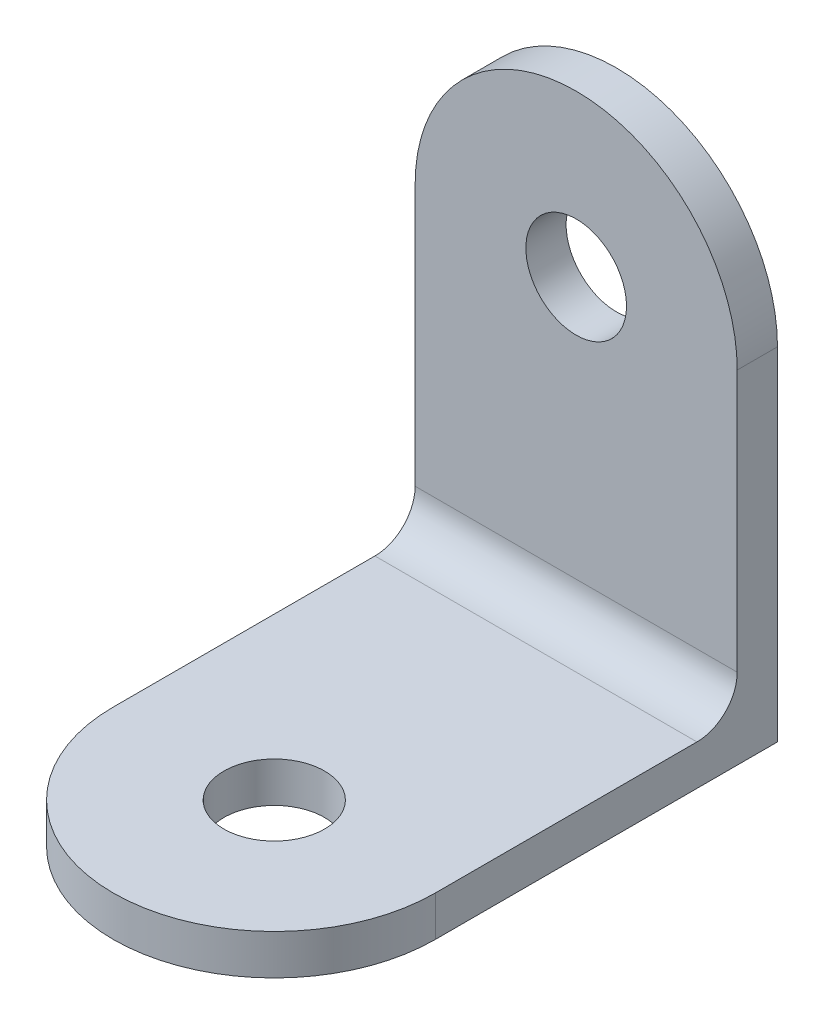
ISO-10303-21;
HEADER;
FILE_DESCRIPTION(('STEP AP214'),'2;1');
FILE_NAME('part.step','',(''),(''),'','','');
FILE_SCHEMA(('AUTOMOTIVE_DESIGN { 1 0 10303 214 1 1 1 1 }'));
ENDSEC;
DATA;
#1=APPLICATION_CONTEXT('core data for automotive mechanical design processes');
#2=APPLICATION_PROTOCOL_DEFINITION('international standard','automotive_design',2000,#1);
#3=PRODUCT_CONTEXT('',#1,'mechanical');
#4=PRODUCT('Part','Part','',(#3));
#5=PRODUCT_RELATED_PRODUCT_CATEGORY('part','',(#4));
#6=PRODUCT_DEFINITION_FORMATION('','',#4);
#7=PRODUCT_DEFINITION_CONTEXT('part definition',#1,'design');
#8=PRODUCT_DEFINITION('design','',#6,#7);
#9=PRODUCT_DEFINITION_SHAPE('','',#8);
#10=(LENGTH_UNIT() NAMED_UNIT(*) SI_UNIT(.MILLI.,.METRE.));
#11=(NAMED_UNIT(*) PLANE_ANGLE_UNIT() SI_UNIT($,.RADIAN.));
#12=(NAMED_UNIT(*) SI_UNIT($,.STERADIAN.) SOLID_ANGLE_UNIT());
#13=UNCERTAINTY_MEASURE_WITH_UNIT(LENGTH_MEASURE(1.E-05),#10,'distance_accuracy_value','');
#14=(GEOMETRIC_REPRESENTATION_CONTEXT(3) GLOBAL_UNCERTAINTY_ASSIGNED_CONTEXT((#13)) GLOBAL_UNIT_ASSIGNED_CONTEXT((#10,
#11,#12)) REPRESENTATION_CONTEXT('',''));
#15=CARTESIAN_POINT('',(0.,0.,0.));
#16=DIRECTION('',(0.,0.,1.));
#17=DIRECTION('',(1.,0.,0.));
#18=AXIS2_PLACEMENT_3D('',#15,#16,#17);
#19=CARTESIAN_POINT('',(16.,0.,0.));
#20=DIRECTION('',(0.,1.,0.));
#21=DIRECTION('',(0.,0.,1.));
#22=AXIS2_PLACEMENT_3D('',#19,#20,#21);
#23=PLANE('',#22);
#24=CARTESIAN_POINT('',(8.,0.,0.));
#25=DIRECTION('',(0.,1.,0.));
#26=DIRECTION('',(0.,0.,1.));
#27=AXIS2_PLACEMENT_3D('',#24,#25,#26);
#28=CIRCLE('',#27,2.5);
#29=CARTESIAN_POINT('',(8.,0.,2.5));
#30=VERTEX_POINT('',#29);
#31=EDGE_CURVE('E163',#30,#30,#28,.T.);
#32=ORIENTED_EDGE('',*,*,#31,.T.);
#33=EDGE_LOOP('',(#32));
#34=FACE_BOUND('',#33,.T.);
#35=DIRECTION('',(0.,0.,-1.));
#36=VECTOR('',#35,1.);
#37=CARTESIAN_POINT('',(0.,0.,0.));
#38=LINE('',#37,#36);
#39=CARTESIAN_POINT('',(0.,0.,0.));
#40=VERTEX_POINT('',#39);
#41=CARTESIAN_POINT('',(0.,0.,-17.));
#42=VERTEX_POINT('',#41);
#43=EDGE_CURVE('E91',#40,#42,#38,.T.);
#44=ORIENTED_EDGE('',*,*,#43,.T.);
#45=DIRECTION('',(-1.,0.,0.));
#46=VECTOR('',#45,1.);
#47=CARTESIAN_POINT('',(16.,0.,-17.));
#48=LINE('',#47,#46);
#49=CARTESIAN_POINT('',(16.,0.,-17.));
#50=VERTEX_POINT('',#49);
#51=EDGE_CURVE('E131',#50,#42,#48,.T.);
#52=ORIENTED_EDGE('',*,*,#51,.F.);
#53=DIRECTION('',(0.,0.,-1.));
#54=VECTOR('',#53,1.);
#55=CARTESIAN_POINT('',(16.,0.,0.));
#56=LINE('',#55,#54);
#57=CARTESIAN_POINT('',(16.,0.,0.));
#58=VERTEX_POINT('',#57);
#59=EDGE_CURVE('E105',#58,#50,#56,.T.);
#60=ORIENTED_EDGE('',*,*,#59,.F.);
#61=CARTESIAN_POINT('',(8.,0.,0.));
#62=DIRECTION('',(0.,1.,0.));
#63=DIRECTION('',(0.,0.,1.));
#64=AXIS2_PLACEMENT_3D('',#61,#62,#63);
#65=CIRCLE('',#64,8.);
#66=EDGE_CURVE('E104',#58,#40,#65,.F.);
#67=ORIENTED_EDGE('',*,*,#66,.T.);
#68=EDGE_LOOP('',(#44,#52,#60,#67));
#69=FACE_BOUND('',#68,.T.);
#70=ADVANCED_FACE('F34',(#34,#69),#23,.F.);
#71=CARTESIAN_POINT('',(16.,0.,-17.));
#72=DIRECTION('',(0.,0.,1.));
#73=DIRECTION('',(1.,0.,0.));
#74=AXIS2_PLACEMENT_3D('',#71,#72,#73);
#75=PLANE('',#74);
#76=CARTESIAN_POINT('',(8.,17.,-17.));
#77=DIRECTION('',(0.,0.,1.));
#78=DIRECTION('',(1.,0.,0.));
#79=AXIS2_PLACEMENT_3D('',#76,#77,#78);
#80=CIRCLE('',#79,2.5);
#81=CARTESIAN_POINT('',(10.5,17.,-17.));
#82=VERTEX_POINT('',#81);
#83=EDGE_CURVE('E156',#82,#82,#80,.T.);
#84=ORIENTED_EDGE('',*,*,#83,.T.);
#85=EDGE_LOOP('',(#84));
#86=FACE_BOUND('',#85,.T.);
#87=DIRECTION('',(0.,1.,0.));
#88=VECTOR('',#87,1.);
#89=CARTESIAN_POINT('',(0.,0.,-17.));
#90=LINE('',#89,#88);
#91=CARTESIAN_POINT('',(0.,17.,-17.));
#92=VERTEX_POINT('',#91);
#93=EDGE_CURVE('E98',#42,#92,#90,.T.);
#94=ORIENTED_EDGE('',*,*,#93,.T.);
#95=CARTESIAN_POINT('',(8.,17.,-17.));
#96=DIRECTION('',(0.,0.,1.));
#97=DIRECTION('',(1.,0.,0.));
#98=AXIS2_PLACEMENT_3D('',#95,#96,#97);
#99=CIRCLE('',#98,8.);
#100=CARTESIAN_POINT('',(16.,17.,-17.));
#101=VERTEX_POINT('',#100);
#102=EDGE_CURVE('E114',#92,#101,#99,.F.);
#103=ORIENTED_EDGE('',*,*,#102,.T.);
#104=DIRECTION('',(0.,1.,0.));
#105=VECTOR('',#104,1.);
#106=CARTESIAN_POINT('',(16.,0.,-17.));
#107=LINE('',#106,#105);
#108=EDGE_CURVE('E149',#50,#101,#107,.T.);
#109=ORIENTED_EDGE('',*,*,#108,.F.);
#110=ORIENTED_EDGE('',*,*,#51,.T.);
#111=EDGE_LOOP('',(#94,#103,#109,#110));
#112=FACE_BOUND('',#111,.T.);
#113=ADVANCED_FACE('F181',(#86,#112),#75,.F.);
#114=CARTESIAN_POINT('',(16.,17.,-15.));
#115=DIRECTION('',(0.,0.,-1.));
#116=DIRECTION('',(0.,1.,0.));
#117=AXIS2_PLACEMENT_3D('',#114,#115,#116);
#118=PLANE('',#117);
#119=CARTESIAN_POINT('',(8.,17.,-15.));
#120=DIRECTION('',(0.,0.,1.));
#121=DIRECTION('',(1.,0.,0.));
#122=AXIS2_PLACEMENT_3D('',#119,#120,#121);
#123=CIRCLE('',#122,2.5);
#124=CARTESIAN_POINT('',(10.5,17.,-15.));
#125=VERTEX_POINT('',#124);
#126=EDGE_CURVE('E160',#125,#125,#123,.T.);
#127=ORIENTED_EDGE('',*,*,#126,.F.);
#128=EDGE_LOOP('',(#127));
#129=FACE_BOUND('',#128,.T.);
#130=DIRECTION('',(0.,-1.,0.));
#131=VECTOR('',#130,1.);
#132=CARTESIAN_POINT('',(0.,17.,-15.));
#133=LINE('',#132,#131);
#134=CARTESIAN_POINT('',(0.,17.,-15.));
#135=VERTEX_POINT('',#134);
#136=CARTESIAN_POINT('',(0.,4.,-15.));
#137=VERTEX_POINT('',#136);
#138=EDGE_CURVE('E126',#135,#137,#133,.T.);
#139=ORIENTED_EDGE('',*,*,#138,.T.);
#140=DIRECTION('',(-1.,0.,0.));
#141=VECTOR('',#140,1.);
#142=CARTESIAN_POINT('',(16.,4.,-15.));
#143=LINE('',#142,#141);
#144=CARTESIAN_POINT('',(16.,4.,-15.));
#145=VERTEX_POINT('',#144);
#146=EDGE_CURVE('E49',#137,#145,#143,.F.);
#147=ORIENTED_EDGE('',*,*,#146,.T.);
#148=DIRECTION('',(0.,-1.,0.));
#149=VECTOR('',#148,1.);
#150=CARTESIAN_POINT('',(16.,17.,-15.));
#151=LINE('',#150,#149);
#152=CARTESIAN_POINT('',(16.,17.,-15.));
#153=VERTEX_POINT('',#152);
#154=EDGE_CURVE('E144',#153,#145,#151,.T.);
#155=ORIENTED_EDGE('',*,*,#154,.F.);
#156=CARTESIAN_POINT('',(8.,17.,-15.));
#157=DIRECTION('',(0.,0.,1.));
#158=DIRECTION('',(-1.,0.,0.));
#159=AXIS2_PLACEMENT_3D('',#156,#157,#158);
#160=CIRCLE('',#159,8.);
#161=EDGE_CURVE('E109',#153,#135,#160,.T.);
#162=ORIENTED_EDGE('',*,*,#161,.T.);
#163=EDGE_LOOP('',(#139,#147,#155,#162));
#164=FACE_BOUND('',#163,.T.);
#165=ADVANCED_FACE('F174',(#129,#164),#118,.F.);
#166=CARTESIAN_POINT('',(16.,2.,-15.));
#167=DIRECTION('',(0.,-1.,0.));
#168=DIRECTION('',(0.,0.,-1.));
#169=AXIS2_PLACEMENT_3D('',#166,#167,#168);
#170=PLANE('',#169);
#171=CARTESIAN_POINT('',(8.,2.,0.));
#172=DIRECTION('',(0.,1.,0.));
#173=DIRECTION('',(0.,0.,1.));
#174=AXIS2_PLACEMENT_3D('',#171,#172,#173);
#175=CIRCLE('',#174,2.5);
#176=CARTESIAN_POINT('',(8.,2.,2.5));
#177=VERTEX_POINT('',#176);
#178=EDGE_CURVE('E166',#177,#177,#175,.T.);
#179=ORIENTED_EDGE('',*,*,#178,.F.);
#180=EDGE_LOOP('',(#179));
#181=FACE_BOUND('',#180,.T.);
#182=DIRECTION('',(0.,0.,1.));
#183=VECTOR('',#182,1.);
#184=CARTESIAN_POINT('',(16.,2.,-15.));
#185=LINE('',#184,#183);
#186=CARTESIAN_POINT('',(16.,2.,-13.));
#187=VERTEX_POINT('',#186);
#188=CARTESIAN_POINT('',(16.,2.,0.));
#189=VERTEX_POINT('',#188);
#190=EDGE_CURVE('E119',#187,#189,#185,.T.);
#191=ORIENTED_EDGE('',*,*,#190,.F.);
#192=DIRECTION('',(-1.,0.,0.));
#193=VECTOR('',#192,1.);
#194=CARTESIAN_POINT('',(0.,2.,-13.));
#195=LINE('',#194,#193);
#196=CARTESIAN_POINT('',(0.,2.,-13.));
#197=VERTEX_POINT('',#196);
#198=EDGE_CURVE('E133',#187,#197,#195,.T.);
#199=ORIENTED_EDGE('',*,*,#198,.T.);
#200=DIRECTION('',(0.,0.,1.));
#201=VECTOR('',#200,1.);
#202=CARTESIAN_POINT('',(0.,2.,-15.));
#203=LINE('',#202,#201);
#204=CARTESIAN_POINT('',(0.,2.,0.));
#205=VERTEX_POINT('',#204);
#206=EDGE_CURVE('E128',#197,#205,#203,.T.);
#207=ORIENTED_EDGE('',*,*,#206,.T.);
#208=CARTESIAN_POINT('',(8.,2.,0.));
#209=DIRECTION('',(0.,1.,0.));
#210=DIRECTION('',(0.,0.,-1.));
#211=AXIS2_PLACEMENT_3D('',#208,#209,#210);
#212=CIRCLE('',#211,8.);
#213=EDGE_CURVE('E110',#205,#189,#212,.T.);
#214=ORIENTED_EDGE('',*,*,#213,.T.);
#215=EDGE_LOOP('',(#191,#199,#207,#214));
#216=FACE_BOUND('',#215,.T.);
#217=ADVANCED_FACE('F139',(#181,#216),#170,.F.);
#218=CARTESIAN_POINT('',(16.,0.,0.));
#219=DIRECTION('',(1.,0.,0.));
#220=DIRECTION('',(0.,0.,-1.));
#221=AXIS2_PLACEMENT_3D('',#218,#219,#220);
#222=PLANE('',#221);
#223=DIRECTION('',(0.,-1.,0.));
#224=VECTOR('',#223,1.);
#225=CARTESIAN_POINT('',(16.,2.,0.));
#226=LINE('',#225,#224);
#227=EDGE_CURVE('E130',#189,#58,#226,.T.);
#228=ORIENTED_EDGE('',*,*,#227,.T.);
#229=ORIENTED_EDGE('',*,*,#59,.T.);
#230=ORIENTED_EDGE('',*,*,#108,.T.);
#231=DIRECTION('',(0.,0.,1.));
#232=VECTOR('',#231,1.);
#233=CARTESIAN_POINT('',(16.,17.,-17.));
#234=LINE('',#233,#232);
#235=EDGE_CURVE('E146',#101,#153,#234,.T.);
#236=ORIENTED_EDGE('',*,*,#235,.T.);
#237=ORIENTED_EDGE('',*,*,#154,.T.);
#238=CARTESIAN_POINT('',(16.,4.,-13.));
#239=DIRECTION('',(1.,0.,0.));
#240=DIRECTION('',(0.,0.,-1.));
#241=AXIS2_PLACEMENT_3D('',#238,#239,#240);
#242=CIRCLE('',#241,2.);
#243=EDGE_CURVE('E11',#145,#187,#242,.F.);
#244=ORIENTED_EDGE('',*,*,#243,.T.);
#245=ORIENTED_EDGE('',*,*,#190,.T.);
#246=EDGE_LOOP('',(#228,#229,#230,#236,#237,#244,#245));
#247=FACE_BOUND('',#246,.T.);
#248=ADVANCED_FACE('F143',(#247),#222,.T.);
#249=CARTESIAN_POINT('',(0.,0.,0.));
#250=DIRECTION('',(1.,0.,0.));
#251=DIRECTION('',(0.,0.,-1.));
#252=AXIS2_PLACEMENT_3D('',#249,#250,#251);
#253=PLANE('',#252);
#254=DIRECTION('',(0.,-1.,0.));
#255=VECTOR('',#254,1.);
#256=CARTESIAN_POINT('',(0.,2.,0.));
#257=LINE('',#256,#255);
#258=EDGE_CURVE('E95',#205,#40,#257,.T.);
#259=ORIENTED_EDGE('',*,*,#258,.F.);
#260=ORIENTED_EDGE('',*,*,#206,.F.);
#261=CARTESIAN_POINT('',(0.,4.,-13.));
#262=DIRECTION('',(1.,0.,0.));
#263=DIRECTION('',(0.,0.,-1.));
#264=AXIS2_PLACEMENT_3D('',#261,#262,#263);
#265=CIRCLE('',#264,2.);
#266=EDGE_CURVE('E42',#197,#137,#265,.T.);
#267=ORIENTED_EDGE('',*,*,#266,.T.);
#268=ORIENTED_EDGE('',*,*,#138,.F.);
#269=DIRECTION('',(0.,0.,1.));
#270=VECTOR('',#269,1.);
#271=CARTESIAN_POINT('',(0.,17.,-17.));
#272=LINE('',#271,#270);
#273=EDGE_CURVE('E123',#92,#135,#272,.T.);
#274=ORIENTED_EDGE('',*,*,#273,.F.);
#275=ORIENTED_EDGE('',*,*,#93,.F.);
#276=ORIENTED_EDGE('',*,*,#43,.F.);
#277=EDGE_LOOP('',(#259,#260,#267,#268,#274,#275,#276));
#278=FACE_BOUND('',#277,.T.);
#279=ADVANCED_FACE('F93',(#278),#253,.F.);
#280=CARTESIAN_POINT('',(8.,17.,-34.8885438199983));
#281=DIRECTION('',(0.,0.,1.));
#282=DIRECTION('',(1.,0.,0.));
#283=AXIS2_PLACEMENT_3D('',#280,#281,#282);
#284=CYLINDRICAL_SURFACE('',#283,8.);
#285=ORIENTED_EDGE('',*,*,#102,.F.);
#286=ORIENTED_EDGE('',*,*,#273,.T.);
#287=ORIENTED_EDGE('',*,*,#161,.F.);
#288=ORIENTED_EDGE('',*,*,#235,.F.);
#289=EDGE_LOOP('',(#285,#286,#287,#288));
#290=FACE_BOUND('',#289,.T.);
#291=ADVANCED_FACE('F204',(#290),#284,.T.);
#292=CARTESIAN_POINT('',(16.,4.,-13.));
#293=DIRECTION('',(1.,0.,0.));
#294=DIRECTION('',(0.,0.,-1.));
#295=AXIS2_PLACEMENT_3D('',#292,#293,#294);
#296=CYLINDRICAL_SURFACE('',#295,2.);
#297=ORIENTED_EDGE('',*,*,#243,.F.);
#298=ORIENTED_EDGE('',*,*,#146,.F.);
#299=ORIENTED_EDGE('',*,*,#266,.F.);
#300=ORIENTED_EDGE('',*,*,#198,.F.);
#301=EDGE_LOOP('',(#297,#298,#299,#300));
#302=FACE_BOUND('',#301,.T.);
#303=ADVANCED_FACE('F36',(#302),#296,.F.);
#304=CARTESIAN_POINT('',(8.,-17.8885438199983,0.));
#305=DIRECTION('',(0.,1.,0.));
#306=DIRECTION('',(0.,0.,1.));
#307=AXIS2_PLACEMENT_3D('',#304,#305,#306);
#308=CYLINDRICAL_SURFACE('',#307,8.);
#309=ORIENTED_EDGE('',*,*,#66,.F.);
#310=ORIENTED_EDGE('',*,*,#227,.F.);
#311=ORIENTED_EDGE('',*,*,#213,.F.);
#312=ORIENTED_EDGE('',*,*,#258,.T.);
#313=EDGE_LOOP('',(#309,#310,#311,#312));
#314=FACE_BOUND('',#313,.T.);
#315=ADVANCED_FACE('F112',(#314),#308,.T.);
#316=CARTESIAN_POINT('',(8.,17.,-31.));
#317=DIRECTION('',(0.,0.,1.));
#318=DIRECTION('',(1.,0.,0.));
#319=AXIS2_PLACEMENT_3D('',#316,#317,#318);
#320=CYLINDRICAL_SURFACE('',#319,2.5);
#321=ORIENTED_EDGE('',*,*,#126,.T.);
#322=EDGE_LOOP('',(#321));
#323=FACE_BOUND('',#322,.T.);
#324=ORIENTED_EDGE('',*,*,#83,.F.);
#325=EDGE_LOOP('',(#324));
#326=FACE_BOUND('',#325,.T.);
#327=ADVANCED_FACE('F194',(#323,#326),#320,.F.);
#328=CARTESIAN_POINT('',(8.,-14.,0.));
#329=DIRECTION('',(0.,1.,0.));
#330=DIRECTION('',(0.,0.,1.));
#331=AXIS2_PLACEMENT_3D('',#328,#329,#330);
#332=CYLINDRICAL_SURFACE('',#331,2.5);
#333=ORIENTED_EDGE('',*,*,#178,.T.);
#334=EDGE_LOOP('',(#333));
#335=FACE_BOUND('',#334,.T.);
#336=ORIENTED_EDGE('',*,*,#31,.F.);
#337=EDGE_LOOP('',(#336));
#338=FACE_BOUND('',#337,.T.);
#339=ADVANCED_FACE('F170',(#335,#338),#332,.F.);
#340=CLOSED_SHELL('',(#70,#113,#165,#217,#248,#279,#291,#303,#315,#327,#339));
#341=MANIFOLD_SOLID_BREP('B2',#340);
#342=ADVANCED_BREP_SHAPE_REPRESENTATION('',(#18,#341),#14);
#343=SHAPE_DEFINITION_REPRESENTATION(#9,#342);
ENDSEC;
END-ISO-10303-21;
